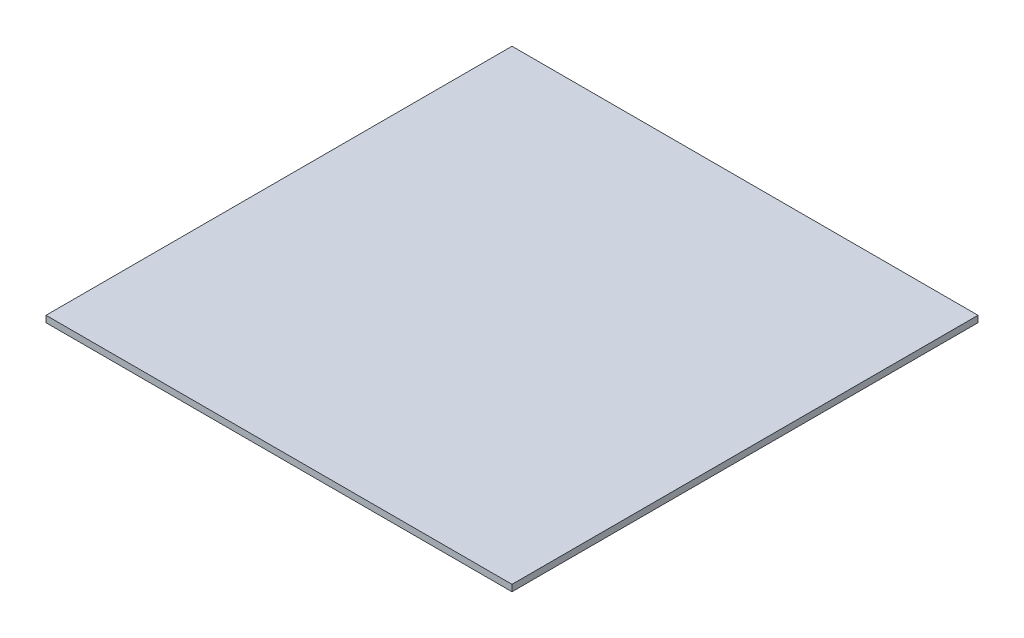
ISO-10303-21;
HEADER;
FILE_DESCRIPTION(('STEP AP214'),'2;1');
FILE_NAME('part.step','',(''),(''),'','','');
FILE_SCHEMA(('AUTOMOTIVE_DESIGN { 1 0 10303 214 1 1 1 1 }'));
ENDSEC;
DATA;
#1=APPLICATION_CONTEXT('core data for automotive mechanical design processes');
#2=APPLICATION_PROTOCOL_DEFINITION('international standard','automotive_design',2000,#1);
#3=PRODUCT_CONTEXT('',#1,'mechanical');
#4=PRODUCT('Part','Part','',(#3));
#5=PRODUCT_RELATED_PRODUCT_CATEGORY('part','',(#4));
#6=PRODUCT_DEFINITION_FORMATION('','',#4);
#7=PRODUCT_DEFINITION_CONTEXT('part definition',#1,'design');
#8=PRODUCT_DEFINITION('design','',#6,#7);
#9=PRODUCT_DEFINITION_SHAPE('','',#8);
#10=(LENGTH_UNIT() NAMED_UNIT(*) SI_UNIT(.MILLI.,.METRE.));
#11=(NAMED_UNIT(*) PLANE_ANGLE_UNIT() SI_UNIT($,.RADIAN.));
#12=(NAMED_UNIT(*) SI_UNIT($,.STERADIAN.) SOLID_ANGLE_UNIT());
#13=UNCERTAINTY_MEASURE_WITH_UNIT(LENGTH_MEASURE(1.E-05),#10,'distance_accuracy_value','');
#14=(GEOMETRIC_REPRESENTATION_CONTEXT(3) GLOBAL_UNCERTAINTY_ASSIGNED_CONTEXT((#13)) GLOBAL_UNIT_ASSIGNED_CONTEXT((#10,
#11,#12)) REPRESENTATION_CONTEXT('',''));
#15=CARTESIAN_POINT('',(0.,0.,0.));
#16=DIRECTION('',(0.,0.,1.));
#17=DIRECTION('',(1.,0.,0.));
#18=AXIS2_PLACEMENT_3D('',#15,#16,#17);
#19=CARTESIAN_POINT('',(-914.4,-25.4,-914.4));
#20=DIRECTION('',(-1.,0.,0.));
#21=DIRECTION('',(0.,0.,1.));
#22=AXIS2_PLACEMENT_3D('',#19,#20,#21);
#23=PLANE('',#22);
#24=DIRECTION('',(0.,0.,1.));
#25=VECTOR('',#24,1.);
#26=CARTESIAN_POINT('',(-914.4,0.,-914.4));
#27=LINE('',#26,#25);
#28=CARTESIAN_POINT('',(-914.4,0.,-914.4));
#29=VERTEX_POINT('',#28);
#30=CARTESIAN_POINT('',(-914.4,0.,914.4));
#31=VERTEX_POINT('',#30);
#32=EDGE_CURVE('E97',#29,#31,#27,.T.);
#33=ORIENTED_EDGE('',*,*,#32,.F.);
#34=DIRECTION('',(0.,1.,0.));
#35=VECTOR('',#34,1.);
#36=CARTESIAN_POINT('',(-914.4,-25.4,-914.4));
#37=LINE('',#36,#35);
#38=CARTESIAN_POINT('',(-914.4,-25.4,-914.4));
#39=VERTEX_POINT('',#38);
#40=EDGE_CURVE('E11',#39,#29,#37,.T.);
#41=ORIENTED_EDGE('',*,*,#40,.F.);
#42=DIRECTION('',(0.,0.,1.));
#43=VECTOR('',#42,1.);
#44=CARTESIAN_POINT('',(-914.4,-25.4,-914.4));
#45=LINE('',#44,#43);
#46=CARTESIAN_POINT('',(-914.4,-25.4,914.4));
#47=VERTEX_POINT('',#46);
#48=EDGE_CURVE('E91',#39,#47,#45,.T.);
#49=ORIENTED_EDGE('',*,*,#48,.T.);
#50=DIRECTION('',(0.,1.,0.));
#51=VECTOR('',#50,1.);
#52=CARTESIAN_POINT('',(-914.4,-25.4,914.4));
#53=LINE('',#52,#51);
#54=EDGE_CURVE('E36',#47,#31,#53,.T.);
#55=ORIENTED_EDGE('',*,*,#54,.T.);
#56=EDGE_LOOP('',(#33,#41,#49,#55));
#57=FACE_BOUND('',#56,.T.);
#58=ADVANCED_FACE('F33',(#57),#23,.T.);
#59=CARTESIAN_POINT('',(-914.4,-25.4,-914.4));
#60=DIRECTION('',(0.,0.,-1.));
#61=DIRECTION('',(-1.,0.,0.));
#62=AXIS2_PLACEMENT_3D('',#59,#60,#61);
#63=PLANE('',#62);
#64=DIRECTION('',(-1.,0.,0.));
#65=VECTOR('',#64,1.);
#66=CARTESIAN_POINT('',(-914.4,0.,-914.4));
#67=LINE('',#66,#65);
#68=CARTESIAN_POINT('',(914.4,0.,-914.4));
#69=VERTEX_POINT('',#68);
#70=EDGE_CURVE('E93',#69,#29,#67,.T.);
#71=ORIENTED_EDGE('',*,*,#70,.F.);
#72=DIRECTION('',(0.,1.,0.));
#73=VECTOR('',#72,1.);
#74=CARTESIAN_POINT('',(914.4,-25.4,-914.4));
#75=LINE('',#74,#73);
#76=CARTESIAN_POINT('',(914.4,-25.4,-914.4));
#77=VERTEX_POINT('',#76);
#78=EDGE_CURVE('E42',#77,#69,#75,.T.);
#79=ORIENTED_EDGE('',*,*,#78,.F.);
#80=DIRECTION('',(-1.,0.,0.));
#81=VECTOR('',#80,1.);
#82=CARTESIAN_POINT('',(-914.4,-25.4,-914.4));
#83=LINE('',#82,#81);
#84=EDGE_CURVE('E88',#77,#39,#83,.T.);
#85=ORIENTED_EDGE('',*,*,#84,.T.);
#86=ORIENTED_EDGE('',*,*,#40,.T.);
#87=EDGE_LOOP('',(#71,#79,#85,#86));
#88=FACE_BOUND('',#87,.T.);
#89=ADVANCED_FACE('F107',(#88),#63,.T.);
#90=CARTESIAN_POINT('',(914.4,-25.4,-914.4));
#91=DIRECTION('',(1.,0.,0.));
#92=DIRECTION('',(0.,0.,-1.));
#93=AXIS2_PLACEMENT_3D('',#90,#91,#92);
#94=PLANE('',#93);
#95=DIRECTION('',(0.,0.,-1.));
#96=VECTOR('',#95,1.);
#97=CARTESIAN_POINT('',(914.4,0.,-914.4));
#98=LINE('',#97,#96);
#99=CARTESIAN_POINT('',(914.4,0.,914.4));
#100=VERTEX_POINT('',#99);
#101=EDGE_CURVE('E83',#100,#69,#98,.T.);
#102=ORIENTED_EDGE('',*,*,#101,.F.);
#103=DIRECTION('',(0.,1.,0.));
#104=VECTOR('',#103,1.);
#105=CARTESIAN_POINT('',(914.4,-25.4,914.4));
#106=LINE('',#105,#104);
#107=CARTESIAN_POINT('',(914.4,-25.4,914.4));
#108=VERTEX_POINT('',#107);
#109=EDGE_CURVE('E78',#108,#100,#106,.T.);
#110=ORIENTED_EDGE('',*,*,#109,.F.);
#111=DIRECTION('',(0.,0.,-1.));
#112=VECTOR('',#111,1.);
#113=CARTESIAN_POINT('',(914.4,-25.4,-914.4));
#114=LINE('',#113,#112);
#115=EDGE_CURVE('E81',#108,#77,#114,.T.);
#116=ORIENTED_EDGE('',*,*,#115,.T.);
#117=ORIENTED_EDGE('',*,*,#78,.T.);
#118=EDGE_LOOP('',(#102,#110,#116,#117));
#119=FACE_BOUND('',#118,.T.);
#120=ADVANCED_FACE('F80',(#119),#94,.T.);
#121=CARTESIAN_POINT('',(-914.4,-25.4,914.4));
#122=DIRECTION('',(0.,0.,1.));
#123=DIRECTION('',(1.,0.,0.));
#124=AXIS2_PLACEMENT_3D('',#121,#122,#123);
#125=PLANE('',#124);
#126=DIRECTION('',(1.,0.,0.));
#127=VECTOR('',#126,1.);
#128=CARTESIAN_POINT('',(-914.4,0.,914.4));
#129=LINE('',#128,#127);
#130=EDGE_CURVE('E100',#31,#100,#129,.T.);
#131=ORIENTED_EDGE('',*,*,#130,.F.);
#132=ORIENTED_EDGE('',*,*,#54,.F.);
#133=DIRECTION('',(1.,0.,0.));
#134=VECTOR('',#133,1.);
#135=CARTESIAN_POINT('',(-914.4,-25.4,914.4));
#136=LINE('',#135,#134);
#137=EDGE_CURVE('E87',#47,#108,#136,.T.);
#138=ORIENTED_EDGE('',*,*,#137,.T.);
#139=ORIENTED_EDGE('',*,*,#109,.T.);
#140=EDGE_LOOP('',(#131,#132,#138,#139));
#141=FACE_BOUND('',#140,.T.);
#142=ADVANCED_FACE('F90',(#141),#125,.T.);
#143=CARTESIAN_POINT('',(0.,-25.4,0.));
#144=DIRECTION('',(0.,1.,0.));
#145=DIRECTION('',(0.,0.,1.));
#146=AXIS2_PLACEMENT_3D('',#143,#144,#145);
#147=PLANE('',#146);
#148=ORIENTED_EDGE('',*,*,#48,.F.);
#149=ORIENTED_EDGE('',*,*,#84,.F.);
#150=ORIENTED_EDGE('',*,*,#115,.F.);
#151=ORIENTED_EDGE('',*,*,#137,.F.);
#152=EDGE_LOOP('',(#148,#149,#150,#151));
#153=FACE_BOUND('',#152,.T.);
#154=ADVANCED_FACE('F86',(#153),#147,.F.);
#155=CARTESIAN_POINT('',(0.,0.,0.));
#156=DIRECTION('',(0.,1.,0.));
#157=DIRECTION('',(0.,0.,1.));
#158=AXIS2_PLACEMENT_3D('',#155,#156,#157);
#159=PLANE('',#158);
#160=ORIENTED_EDGE('',*,*,#32,.T.);
#161=ORIENTED_EDGE('',*,*,#130,.T.);
#162=ORIENTED_EDGE('',*,*,#101,.T.);
#163=ORIENTED_EDGE('',*,*,#70,.T.);
#164=EDGE_LOOP('',(#160,#161,#162,#163));
#165=FACE_BOUND('',#164,.T.);
#166=ADVANCED_FACE('F106',(#165),#159,.T.);
#167=CLOSED_SHELL('',(#58,#89,#120,#142,#154,#166));
#168=MANIFOLD_SOLID_BREP('B2',#167);
#169=ADVANCED_BREP_SHAPE_REPRESENTATION('',(#18,#168),#14);
#170=SHAPE_DEFINITION_REPRESENTATION(#9,#169);
ENDSEC;
END-ISO-10303-21;
